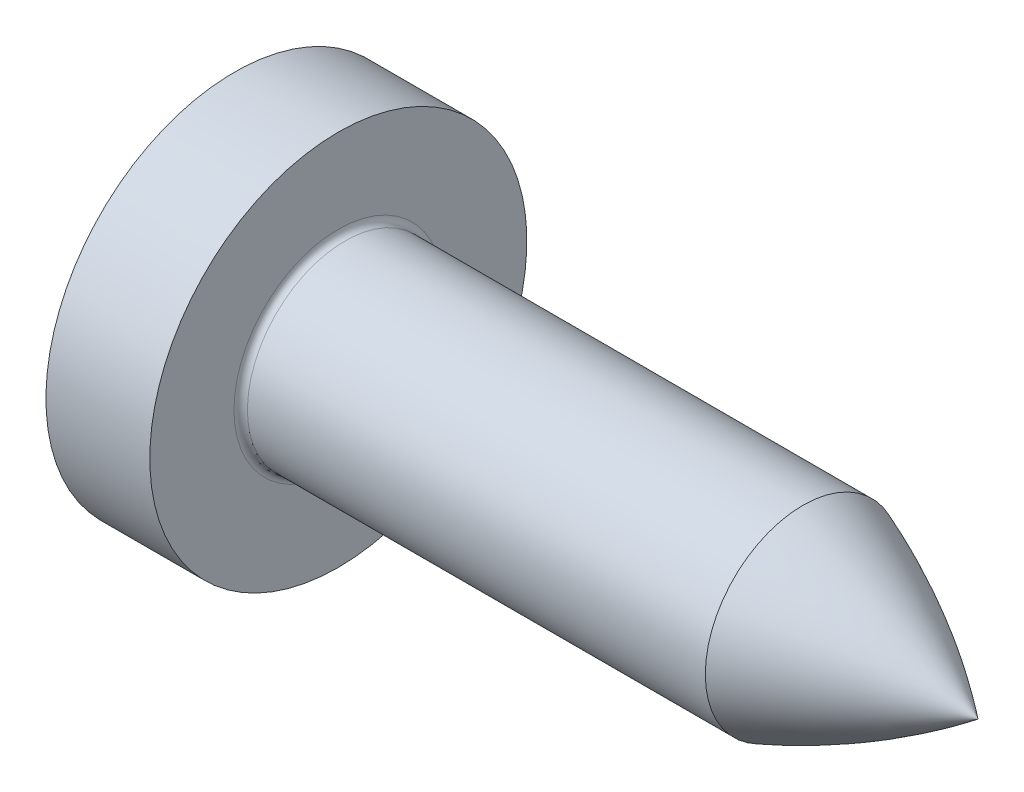
ISO-10303-21;
HEADER;
FILE_DESCRIPTION(('STEP AP214'),'2;1');
FILE_NAME('part.step','',(''),(''),'','','');
FILE_SCHEMA(('AUTOMOTIVE_DESIGN { 1 0 10303 214 1 1 1 1 }'));
ENDSEC;
DATA;
#1=APPLICATION_CONTEXT('core data for automotive mechanical design processes');
#2=APPLICATION_PROTOCOL_DEFINITION('international standard','automotive_design',2000,#1);
#3=PRODUCT_CONTEXT('',#1,'mechanical');
#4=PRODUCT('Part','Part','',(#3));
#5=PRODUCT_RELATED_PRODUCT_CATEGORY('part','',(#4));
#6=PRODUCT_DEFINITION_FORMATION('','',#4);
#7=PRODUCT_DEFINITION_CONTEXT('part definition',#1,'design');
#8=PRODUCT_DEFINITION('design','',#6,#7);
#9=PRODUCT_DEFINITION_SHAPE('','',#8);
#10=(LENGTH_UNIT() NAMED_UNIT(*) SI_UNIT(.MILLI.,.METRE.));
#11=(NAMED_UNIT(*) PLANE_ANGLE_UNIT() SI_UNIT($,.RADIAN.));
#12=(NAMED_UNIT(*) SI_UNIT($,.STERADIAN.) SOLID_ANGLE_UNIT());
#13=UNCERTAINTY_MEASURE_WITH_UNIT(LENGTH_MEASURE(1.E-05),#10,'distance_accuracy_value','');
#14=(GEOMETRIC_REPRESENTATION_CONTEXT(3) GLOBAL_UNCERTAINTY_ASSIGNED_CONTEXT((#13)) GLOBAL_UNIT_ASSIGNED_CONTEXT((#10,
#11,#12)) REPRESENTATION_CONTEXT('',''));
#15=CARTESIAN_POINT('',(0.,0.,0.));
#16=DIRECTION('',(0.,0.,1.));
#17=DIRECTION('',(1.,0.,0.));
#18=AXIS2_PLACEMENT_3D('',#15,#16,#17);
#19=CARTESIAN_POINT('',(-65.5475361696032,0.,0.));
#20=DIRECTION('',(-1.,0.,0.));
#21=DIRECTION('',(0.,-1.,0.));
#22=AXIS2_PLACEMENT_3D('',#19,#20,#21);
#23=CYLINDRICAL_SURFACE('',#22,1.45);
#24=CARTESIAN_POINT('',(2.5,0.,0.));
#25=DIRECTION('',(-1.,0.,0.));
#26=DIRECTION('',(0.,-1.,0.));
#27=AXIS2_PLACEMENT_3D('',#24,#25,#26);
#28=CIRCLE('',#27,1.45);
#29=CARTESIAN_POINT('',(2.5,-1.45000000000001,0.));
#30=VERTEX_POINT('',#29);
#31=EDGE_CURVE('E11',#30,#30,#28,.F.);
#32=ORIENTED_EDGE('',*,*,#31,.T.);
#33=EDGE_LOOP('',(#32));
#34=FACE_BOUND('',#33,.T.);
#35=CARTESIAN_POINT('',(9.3,0.,0.));
#36=DIRECTION('',(1.,0.,0.));
#37=DIRECTION('',(0.,1.,0.));
#38=AXIS2_PLACEMENT_3D('',#35,#36,#37);
#39=CIRCLE('',#38,1.45);
#40=CARTESIAN_POINT('',(9.3,1.45,0.));
#41=VERTEX_POINT('',#40);
#42=EDGE_CURVE('E254',#41,#41,#39,.T.);
#43=ORIENTED_EDGE('',*,*,#42,.F.);
#44=EDGE_LOOP('',(#43));
#45=FACE_BOUND('',#44,.T.);
#46=ADVANCED_FACE('F40',(#34,#45),#23,.T.);
#47=CARTESIAN_POINT('',(5.,0.,0.));
#48=DIRECTION('',(-1.,0.,0.));
#49=DIRECTION('',(0.,1.,0.));
#50=AXIS2_PLACEMENT_3D('',#47,#48,#49);
#51=SPHERICAL_SURFACE('',#50,5.);
#52=CARTESIAN_POINT('',(0.857536964558411,0.,0.));
#53=DIRECTION('',(-1.,0.,0.));
#54=DIRECTION('',(0.,-1.,0.));
#55=AXIS2_PLACEMENT_3D('',#52,#53,#54);
#56=CIRCLE('',#55,2.8);
#57=CARTESIAN_POINT('',(0.857536964558411,-2.80000000000001,0.));
#58=VERTEX_POINT('',#57);
#59=EDGE_CURVE('E212',#58,#58,#56,.T.);
#60=ORIENTED_EDGE('',*,*,#59,.T.);
#61=EDGE_LOOP('',(#60));
#62=FACE_BOUND('',#61,.T.);
#63=CARTESIAN_POINT('',(5.,0.,-0.300000000000001));
#64=DIRECTION('',(0.,0.,1.));
#65=DIRECTION('',(0.,-1.,0.));
#66=AXIS2_PLACEMENT_3D('',#63,#64,#65);
#67=CIRCLE('',#66,4.99099188538711);
#68=CARTESIAN_POINT('',(0.204192141108154,1.3821096123648,-0.300000000000001));
#69=VERTEX_POINT('',#68);
#70=CARTESIAN_POINT('',(0.01803251716754,0.299999999999999,-0.300000000000001));
#71=VERTEX_POINT('',#70);
#72=EDGE_CURVE('E171',#69,#71,#67,.T.);
#73=ORIENTED_EDGE('',*,*,#72,.F.);
#74=CARTESIAN_POINT('',(4.39951905283833,-1.0400635094611,0.));
#75=DIRECTION('',(-0.500000000000001,-0.866025403784438,0.));
#76=DIRECTION('',(0.866025403784438,-0.500000000000001,0.));
#77=AXIS2_PLACEMENT_3D('',#74,#75,#76);
#78=CIRCLE('',#77,4.8536265336739);
#79=CARTESIAN_POINT('',(0.204192141108154,1.3821096123648,0.299999999999999));
#80=VERTEX_POINT('',#79);
#81=EDGE_CURVE('E201',#80,#69,#78,.T.);
#82=ORIENTED_EDGE('',*,*,#81,.F.);
#83=CARTESIAN_POINT('',(5.,0.,0.299999999999999));
#84=DIRECTION('',(0.,0.,-1.));
#85=DIRECTION('',(0.,1.,0.));
#86=AXIS2_PLACEMENT_3D('',#83,#84,#85);
#87=CIRCLE('',#86,4.99099188538711);
#88=CARTESIAN_POINT('',(0.01803251716754,0.299999999999999,0.299999999999999));
#89=VERTEX_POINT('',#88);
#90=EDGE_CURVE('E175',#89,#80,#87,.T.);
#91=ORIENTED_EDGE('',*,*,#90,.F.);
#92=CARTESIAN_POINT('',(5.,0.299999999999999,0.));
#93=DIRECTION('',(0.,-1.,0.));
#94=DIRECTION('',(0.,0.,-1.));
#95=AXIS2_PLACEMENT_3D('',#92,#93,#94);
#96=CIRCLE('',#95,4.99099188538711);
#97=CARTESIAN_POINT('',(0.204192141108152,0.299999999999999,1.3821096123648));
#98=VERTEX_POINT('',#97);
#99=EDGE_CURVE('E167',#98,#89,#96,.T.);
#100=ORIENTED_EDGE('',*,*,#99,.F.);
#101=CARTESIAN_POINT('',(4.39951905283833,0.,-1.0400635094611));
#102=DIRECTION('',(-0.500000000000001,0.,-0.866025403784438));
#103=DIRECTION('',(-0.866025403784438,0.,0.500000000000001));
#104=AXIS2_PLACEMENT_3D('',#101,#102,#103);
#105=CIRCLE('',#104,4.8536265336739);
#106=CARTESIAN_POINT('',(0.204192141108151,-0.300000000000001,1.3821096123648));
#107=VERTEX_POINT('',#106);
#108=EDGE_CURVE('E165',#107,#98,#105,.T.);
#109=ORIENTED_EDGE('',*,*,#108,.F.);
#110=CARTESIAN_POINT('',(5.,-0.300000000000001,0.));
#111=DIRECTION('',(0.,1.,0.));
#112=DIRECTION('',(0.,0.,1.));
#113=AXIS2_PLACEMENT_3D('',#110,#111,#112);
#114=CIRCLE('',#113,4.99099188538711);
#115=CARTESIAN_POINT('',(0.0180325171675391,-0.300000000000001,0.299999999999999));
#116=VERTEX_POINT('',#115);
#117=EDGE_CURVE('E149',#116,#107,#114,.T.);
#118=ORIENTED_EDGE('',*,*,#117,.F.);
#119=CARTESIAN_POINT('',(5.,0.,0.299999999999999));
#120=DIRECTION('',(0.,0.,-1.));
#121=DIRECTION('',(0.,1.,0.));
#122=AXIS2_PLACEMENT_3D('',#119,#120,#121);
#123=CIRCLE('',#122,4.99099188538711);
#124=CARTESIAN_POINT('',(0.204192141108149,-1.38210961236481,0.299999999999999));
#125=VERTEX_POINT('',#124);
#126=EDGE_CURVE('E139',#125,#116,#123,.T.);
#127=ORIENTED_EDGE('',*,*,#126,.F.);
#128=CARTESIAN_POINT('',(4.39951905283832,1.0400635094611,0.));
#129=DIRECTION('',(-0.500000000000001,0.866025403784438,0.));
#130=DIRECTION('',(-0.866025403784438,-0.500000000000001,0.));
#131=AXIS2_PLACEMENT_3D('',#128,#129,#130);
#132=CIRCLE('',#131,4.85362653367389);
#133=CARTESIAN_POINT('',(0.204192141108149,-1.3821096123648,-0.300000000000001));
#134=VERTEX_POINT('',#133);
#135=EDGE_CURVE('E150',#134,#125,#132,.T.);
#136=ORIENTED_EDGE('',*,*,#135,.F.);
#137=CARTESIAN_POINT('',(5.,0.,-0.300000000000001));
#138=DIRECTION('',(0.,0.,1.));
#139=DIRECTION('',(0.,-1.,0.));
#140=AXIS2_PLACEMENT_3D('',#137,#138,#139);
#141=CIRCLE('',#140,4.99099188538711);
#142=CARTESIAN_POINT('',(0.0180325171675391,-0.300000000000001,-0.300000000000001));
#143=VERTEX_POINT('',#142);
#144=EDGE_CURVE('E177',#143,#134,#141,.T.);
#145=ORIENTED_EDGE('',*,*,#144,.F.);
#146=CARTESIAN_POINT('',(5.,-0.300000000000001,0.));
#147=DIRECTION('',(0.,1.,0.));
#148=DIRECTION('',(0.,0.,1.));
#149=AXIS2_PLACEMENT_3D('',#146,#147,#148);
#150=CIRCLE('',#149,4.99099188538711);
#151=CARTESIAN_POINT('',(0.204192141108151,-0.3,-1.3821096123648));
#152=VERTEX_POINT('',#151);
#153=EDGE_CURVE('E189',#152,#143,#150,.T.);
#154=ORIENTED_EDGE('',*,*,#153,.F.);
#155=CARTESIAN_POINT('',(4.39951905283833,0.,1.0400635094611));
#156=DIRECTION('',(-0.500000000000001,0.,0.866025403784438));
#157=DIRECTION('',(0.866025403784438,0.,0.500000000000001));
#158=AXIS2_PLACEMENT_3D('',#155,#156,#157);
#159=CIRCLE('',#158,4.8536265336739);
#160=CARTESIAN_POINT('',(0.204192141108152,0.299999999999999,-1.3821096123648));
#161=VERTEX_POINT('',#160);
#162=EDGE_CURVE('E187',#161,#152,#159,.T.);
#163=ORIENTED_EDGE('',*,*,#162,.F.);
#164=CARTESIAN_POINT('',(5.,0.299999999999999,0.));
#165=DIRECTION('',(0.,-1.,0.));
#166=DIRECTION('',(0.,0.,-1.));
#167=AXIS2_PLACEMENT_3D('',#164,#165,#166);
#168=CIRCLE('',#167,4.99099188538711);
#169=EDGE_CURVE('E190',#71,#161,#168,.T.);
#170=ORIENTED_EDGE('',*,*,#169,.F.);
#171=EDGE_LOOP('',(#73,#82,#91,#100,#109,#118,#127,#136,#145,#154,#163,#170));
#172=FACE_BOUND('',#171,.T.);
#173=ADVANCED_FACE('F162',(#62,#172),#51,.T.);
#174=CARTESIAN_POINT('',(2.4,1.44999999999998,0.));
#175=DIRECTION('',(-1.,0.,0.));
#176=DIRECTION('',(0.,-1.,0.));
#177=AXIS2_PLACEMENT_3D('',#174,#175,#176);
#178=PLANE('',#177);
#179=CARTESIAN_POINT('',(2.4,0.,0.));
#180=DIRECTION('',(-1.,0.,0.));
#181=DIRECTION('',(0.,-1.,0.));
#182=AXIS2_PLACEMENT_3D('',#179,#180,#181);
#183=CIRCLE('',#182,1.55);
#184=CARTESIAN_POINT('',(2.4,-1.55000000000001,0.));
#185=VERTEX_POINT('',#184);
#186=EDGE_CURVE('E50',#185,#185,#183,.T.);
#187=ORIENTED_EDGE('',*,*,#186,.T.);
#188=EDGE_LOOP('',(#187));
#189=FACE_BOUND('',#188,.T.);
#190=CARTESIAN_POINT('',(2.4,0.,0.));
#191=DIRECTION('',(-1.,0.,0.));
#192=DIRECTION('',(0.,-1.,0.));
#193=AXIS2_PLACEMENT_3D('',#190,#191,#192);
#194=CIRCLE('',#193,2.8);
#195=CARTESIAN_POINT('',(2.4,-2.80000000000001,0.));
#196=VERTEX_POINT('',#195);
#197=EDGE_CURVE('E232',#196,#196,#194,.T.);
#198=ORIENTED_EDGE('',*,*,#197,.F.);
#199=EDGE_LOOP('',(#198));
#200=FACE_BOUND('',#199,.T.);
#201=ADVANCED_FACE('F268',(#189,#200),#178,.F.);
#202=CARTESIAN_POINT('',(-65.5475361696032,0.,0.));
#203=DIRECTION('',(-1.,0.,0.));
#204=DIRECTION('',(0.,-1.,0.));
#205=AXIS2_PLACEMENT_3D('',#202,#203,#204);
#206=CYLINDRICAL_SURFACE('',#205,2.8);
#207=ORIENTED_EDGE('',*,*,#59,.F.);
#208=EDGE_LOOP('',(#207));
#209=FACE_BOUND('',#208,.T.);
#210=ORIENTED_EDGE('',*,*,#197,.T.);
#211=EDGE_LOOP('',(#210));
#212=FACE_BOUND('',#211,.T.);
#213=ADVANCED_FACE('F293',(#209,#212),#206,.T.);
#214=CARTESIAN_POINT('',(1.75,1.5,-0.300000000000001));
#215=DIRECTION('',(0.,0.,1.));
#216=DIRECTION('',(0.,-1.,0.));
#217=AXIS2_PLACEMENT_3D('',#214,#215,#216);
#218=PLANE('',#217);
#219=ORIENTED_EDGE('',*,*,#72,.T.);
#220=DIRECTION('',(-1.,0.,0.));
#221=VECTOR('',#220,1.);
#222=CARTESIAN_POINT('',(1.75,0.299999999999999,-0.300000000000001));
#223=LINE('',#222,#221);
#224=CARTESIAN_POINT('',(1.75,0.299999999999999,-0.300000000000001));
#225=VERTEX_POINT('',#224);
#226=EDGE_CURVE('E59',#225,#71,#223,.T.);
#227=ORIENTED_EDGE('',*,*,#226,.F.);
#228=DIRECTION('',(0.,1.,0.));
#229=VECTOR('',#228,1.);
#230=CARTESIAN_POINT('',(1.75,1.5,-0.300000000000001));
#231=LINE('',#230,#229);
#232=CARTESIAN_POINT('',(1.75,0.489637028918152,-0.300000000000001));
#233=VERTEX_POINT('',#232);
#234=EDGE_CURVE('E210',#225,#233,#231,.T.);
#235=ORIENTED_EDGE('',*,*,#234,.T.);
#236=DIRECTION('',(-0.866025403784438,0.500000000000001,0.));
#237=VECTOR('',#236,1.);
#238=CARTESIAN_POINT('',(0.,1.5,-0.300000000000001));
#239=LINE('',#238,#237);
#240=EDGE_CURVE('E206',#233,#69,#239,.T.);
#241=ORIENTED_EDGE('',*,*,#240,.T.);
#242=EDGE_LOOP('',(#219,#227,#235,#241));
#243=FACE_BOUND('',#242,.T.);
#244=ADVANCED_FACE('F249',(#243),#218,.T.);
#245=CARTESIAN_POINT('',(0.,1.5,0.));
#246=DIRECTION('',(-0.500000000000001,-0.866025403784438,0.));
#247=DIRECTION('',(0.866025403784438,-0.500000000000001,0.));
#248=AXIS2_PLACEMENT_3D('',#245,#246,#247);
#249=PLANE('',#248);
#250=ORIENTED_EDGE('',*,*,#81,.T.);
#251=ORIENTED_EDGE('',*,*,#240,.F.);
#252=DIRECTION('',(0.,0.,1.));
#253=VECTOR('',#252,1.);
#254=CARTESIAN_POINT('',(1.75,0.489637028918152,0.));
#255=LINE('',#254,#253);
#256=CARTESIAN_POINT('',(1.75,0.489637028918152,0.299999999999999));
#257=VERTEX_POINT('',#256);
#258=EDGE_CURVE('E208',#233,#257,#255,.T.);
#259=ORIENTED_EDGE('',*,*,#258,.T.);
#260=DIRECTION('',(-0.866025403784438,0.500000000000001,0.));
#261=VECTOR('',#260,1.);
#262=CARTESIAN_POINT('',(1.3125,0.742227771688615,0.299999999999999));
#263=LINE('',#262,#261);
#264=EDGE_CURVE('E203',#257,#80,#263,.T.);
#265=ORIENTED_EDGE('',*,*,#264,.T.);
#266=EDGE_LOOP('',(#250,#251,#259,#265));
#267=FACE_BOUND('',#266,.T.);
#268=ADVANCED_FACE('F244',(#267),#249,.T.);
#269=CARTESIAN_POINT('',(1.75,1.5,0.299999999999999));
#270=DIRECTION('',(0.,0.,-1.));
#271=DIRECTION('',(0.,1.,0.));
#272=AXIS2_PLACEMENT_3D('',#269,#270,#271);
#273=PLANE('',#272);
#274=ORIENTED_EDGE('',*,*,#90,.T.);
#275=ORIENTED_EDGE('',*,*,#264,.F.);
#276=DIRECTION('',(0.,-1.,0.));
#277=VECTOR('',#276,1.);
#278=CARTESIAN_POINT('',(1.75,1.5,0.299999999999999));
#279=LINE('',#278,#277);
#280=CARTESIAN_POINT('',(1.75,0.299999999999999,0.299999999999999));
#281=VERTEX_POINT('',#280);
#282=EDGE_CURVE('E125',#257,#281,#279,.T.);
#283=ORIENTED_EDGE('',*,*,#282,.T.);
#284=DIRECTION('',(-1.,0.,0.));
#285=VECTOR('',#284,1.);
#286=CARTESIAN_POINT('',(1.75,0.299999999999999,0.299999999999999));
#287=LINE('',#286,#285);
#288=EDGE_CURVE('E207',#281,#89,#287,.T.);
#289=ORIENTED_EDGE('',*,*,#288,.T.);
#290=EDGE_LOOP('',(#274,#275,#283,#289));
#291=FACE_BOUND('',#290,.T.);
#292=ADVANCED_FACE('F241',(#291),#273,.T.);
#293=CARTESIAN_POINT('',(1.75,0.299999999999999,0.299999999999999));
#294=DIRECTION('',(0.,-1.,0.));
#295=DIRECTION('',(0.,0.,-1.));
#296=AXIS2_PLACEMENT_3D('',#293,#294,#295);
#297=PLANE('',#296);
#298=ORIENTED_EDGE('',*,*,#99,.T.);
#299=ORIENTED_EDGE('',*,*,#288,.F.);
#300=DIRECTION('',(0.,0.,1.));
#301=VECTOR('',#300,1.);
#302=CARTESIAN_POINT('',(1.75,0.299999999999999,0.299999999999999));
#303=LINE('',#302,#301);
#304=CARTESIAN_POINT('',(1.75,0.299999999999999,0.489637028918151));
#305=VERTEX_POINT('',#304);
#306=EDGE_CURVE('E117',#281,#305,#303,.T.);
#307=ORIENTED_EDGE('',*,*,#306,.T.);
#308=DIRECTION('',(-0.866025403784438,0.,0.500000000000001));
#309=VECTOR('',#308,1.);
#310=CARTESIAN_POINT('',(0.,0.299999999999999,1.5));
#311=LINE('',#310,#309);
#312=EDGE_CURVE('E44',#305,#98,#311,.T.);
#313=ORIENTED_EDGE('',*,*,#312,.T.);
#314=EDGE_LOOP('',(#298,#299,#307,#313));
#315=FACE_BOUND('',#314,.T.);
#316=ADVANCED_FACE('F286',(#315),#297,.T.);
#317=CARTESIAN_POINT('',(0.,0.,1.5));
#318=DIRECTION('',(-0.500000000000001,0.,-0.866025403784438));
#319=DIRECTION('',(-0.866025403784438,0.,0.500000000000001));
#320=AXIS2_PLACEMENT_3D('',#317,#318,#319);
#321=PLANE('',#320);
#322=ORIENTED_EDGE('',*,*,#108,.T.);
#323=ORIENTED_EDGE('',*,*,#312,.F.);
#324=DIRECTION('',(0.,-1.,0.));
#325=VECTOR('',#324,1.);
#326=CARTESIAN_POINT('',(1.75,0.,0.489637028918151));
#327=LINE('',#326,#325);
#328=CARTESIAN_POINT('',(1.75,-0.300000000000001,0.489637028918151));
#329=VERTEX_POINT('',#328);
#330=EDGE_CURVE('E214',#305,#329,#327,.T.);
#331=ORIENTED_EDGE('',*,*,#330,.T.);
#332=DIRECTION('',(-0.866025403784438,0.,0.500000000000001));
#333=VECTOR('',#332,1.);
#334=CARTESIAN_POINT('',(1.83211524227066,-0.300000000000001,0.442227771688613));
#335=LINE('',#334,#333);
#336=EDGE_CURVE('E158',#329,#107,#335,.T.);
#337=ORIENTED_EDGE('',*,*,#336,.T.);
#338=EDGE_LOOP('',(#322,#323,#331,#337));
#339=FACE_BOUND('',#338,.T.);
#340=ADVANCED_FACE('F284',(#339),#321,.T.);
#341=CARTESIAN_POINT('',(1.75,-0.300000000000001,0.299999999999999));
#342=DIRECTION('',(0.,1.,0.));
#343=DIRECTION('',(0.,0.,1.));
#344=AXIS2_PLACEMENT_3D('',#341,#342,#343);
#345=PLANE('',#344);
#346=ORIENTED_EDGE('',*,*,#117,.T.);
#347=ORIENTED_EDGE('',*,*,#336,.F.);
#348=DIRECTION('',(0.,0.,-1.));
#349=VECTOR('',#348,1.);
#350=CARTESIAN_POINT('',(1.75,-0.300000000000001,0.299999999999999));
#351=LINE('',#350,#349);
#352=CARTESIAN_POINT('',(1.75,-0.300000000000001,0.299999999999999));
#353=VERTEX_POINT('',#352);
#354=EDGE_CURVE('E157',#329,#353,#351,.T.);
#355=ORIENTED_EDGE('',*,*,#354,.T.);
#356=DIRECTION('',(-1.,0.,0.));
#357=VECTOR('',#356,1.);
#358=CARTESIAN_POINT('',(1.75,-0.300000000000001,0.299999999999999));
#359=LINE('',#358,#357);
#360=EDGE_CURVE('E142',#353,#116,#359,.T.);
#361=ORIENTED_EDGE('',*,*,#360,.T.);
#362=EDGE_LOOP('',(#346,#347,#355,#361));
#363=FACE_BOUND('',#362,.T.);
#364=ADVANCED_FACE('F153',(#363),#345,.T.);
#365=CARTESIAN_POINT('',(1.75,-1.5,0.299999999999999));
#366=DIRECTION('',(0.,0.,-1.));
#367=DIRECTION('',(0.,1.,0.));
#368=AXIS2_PLACEMENT_3D('',#365,#366,#367);
#369=PLANE('',#368);
#370=ORIENTED_EDGE('',*,*,#126,.T.);
#371=ORIENTED_EDGE('',*,*,#360,.F.);
#372=DIRECTION('',(0.,-1.,0.));
#373=VECTOR('',#372,1.);
#374=CARTESIAN_POINT('',(1.75,-1.5,0.299999999999999));
#375=LINE('',#374,#373);
#376=CARTESIAN_POINT('',(1.75,-0.489637028918154,0.299999999999999));
#377=VERTEX_POINT('',#376);
#378=EDGE_CURVE('E185',#353,#377,#375,.T.);
#379=ORIENTED_EDGE('',*,*,#378,.T.);
#380=DIRECTION('',(-0.866025403784438,-0.500000000000001,0.));
#381=VECTOR('',#380,1.);
#382=CARTESIAN_POINT('',(0.,-1.5,0.299999999999999));
#383=LINE('',#382,#381);
#384=EDGE_CURVE('E145',#377,#125,#383,.T.);
#385=ORIENTED_EDGE('',*,*,#384,.T.);
#386=EDGE_LOOP('',(#370,#371,#379,#385));
#387=FACE_BOUND('',#386,.T.);
#388=ADVANCED_FACE('F141',(#387),#369,.T.);
#389=CARTESIAN_POINT('',(0.,-1.5,0.));
#390=DIRECTION('',(-0.500000000000001,0.866025403784438,0.));
#391=DIRECTION('',(-0.866025403784438,-0.500000000000001,0.));
#392=AXIS2_PLACEMENT_3D('',#389,#390,#391);
#393=PLANE('',#392);
#394=ORIENTED_EDGE('',*,*,#135,.T.);
#395=ORIENTED_EDGE('',*,*,#384,.F.);
#396=DIRECTION('',(0.,0.,-1.));
#397=VECTOR('',#396,1.);
#398=CARTESIAN_POINT('',(1.75,-0.489637028918154,0.));
#399=LINE('',#398,#397);
#400=CARTESIAN_POINT('',(1.75,-0.489637028918154,-0.300000000000001));
#401=VERTEX_POINT('',#400);
#402=EDGE_CURVE('E182',#377,#401,#399,.T.);
#403=ORIENTED_EDGE('',*,*,#402,.T.);
#404=DIRECTION('',(-0.866025403784438,-0.500000000000001,0.));
#405=VECTOR('',#404,1.);
#406=CARTESIAN_POINT('',(1.3125,-0.742227771688617,-0.300000000000001));
#407=LINE('',#406,#405);
#408=EDGE_CURVE('E178',#401,#134,#407,.T.);
#409=ORIENTED_EDGE('',*,*,#408,.T.);
#410=EDGE_LOOP('',(#394,#395,#403,#409));
#411=FACE_BOUND('',#410,.T.);
#412=ADVANCED_FACE('F279',(#411),#393,.T.);
#413=CARTESIAN_POINT('',(1.75,-1.5,-0.300000000000001));
#414=DIRECTION('',(0.,0.,1.));
#415=DIRECTION('',(0.,-1.,0.));
#416=AXIS2_PLACEMENT_3D('',#413,#414,#415);
#417=PLANE('',#416);
#418=ORIENTED_EDGE('',*,*,#144,.T.);
#419=ORIENTED_EDGE('',*,*,#408,.F.);
#420=DIRECTION('',(0.,1.,0.));
#421=VECTOR('',#420,1.);
#422=CARTESIAN_POINT('',(1.75,-1.5,-0.300000000000001));
#423=LINE('',#422,#421);
#424=CARTESIAN_POINT('',(1.75,-0.300000000000001,-0.300000000000001));
#425=VERTEX_POINT('',#424);
#426=EDGE_CURVE('E184',#401,#425,#423,.T.);
#427=ORIENTED_EDGE('',*,*,#426,.T.);
#428=DIRECTION('',(-1.,0.,0.));
#429=VECTOR('',#428,1.);
#430=CARTESIAN_POINT('',(1.75,-0.300000000000001,-0.300000000000001));
#431=LINE('',#430,#429);
#432=EDGE_CURVE('E181',#425,#143,#431,.T.);
#433=ORIENTED_EDGE('',*,*,#432,.T.);
#434=EDGE_LOOP('',(#418,#419,#427,#433));
#435=FACE_BOUND('',#434,.T.);
#436=ADVANCED_FACE('F282',(#435),#417,.T.);
#437=CARTESIAN_POINT('',(1.75,-0.300000000000001,-0.300000000000001));
#438=DIRECTION('',(0.,1.,0.));
#439=DIRECTION('',(0.,0.,1.));
#440=AXIS2_PLACEMENT_3D('',#437,#438,#439);
#441=PLANE('',#440);
#442=ORIENTED_EDGE('',*,*,#153,.T.);
#443=ORIENTED_EDGE('',*,*,#432,.F.);
#444=DIRECTION('',(0.,0.,-1.));
#445=VECTOR('',#444,1.);
#446=CARTESIAN_POINT('',(1.75,-0.300000000000001,-0.300000000000001));
#447=LINE('',#446,#445);
#448=CARTESIAN_POINT('',(1.75,-0.300000000000001,-0.489637028918153));
#449=VERTEX_POINT('',#448);
#450=EDGE_CURVE('E198',#425,#449,#447,.T.);
#451=ORIENTED_EDGE('',*,*,#450,.T.);
#452=DIRECTION('',(-0.866025403784438,0.,-0.500000000000001));
#453=VECTOR('',#452,1.);
#454=CARTESIAN_POINT('',(0.,-0.3,-1.5));
#455=LINE('',#454,#453);
#456=EDGE_CURVE('E194',#449,#152,#455,.T.);
#457=ORIENTED_EDGE('',*,*,#456,.T.);
#458=EDGE_LOOP('',(#442,#443,#451,#457));
#459=FACE_BOUND('',#458,.T.);
#460=ADVANCED_FACE('F308',(#459),#441,.T.);
#461=CARTESIAN_POINT('',(0.,0.,-1.5));
#462=DIRECTION('',(-0.500000000000001,0.,0.866025403784438));
#463=DIRECTION('',(0.866025403784438,0.,0.500000000000001));
#464=AXIS2_PLACEMENT_3D('',#461,#462,#463);
#465=PLANE('',#464);
#466=ORIENTED_EDGE('',*,*,#162,.T.);
#467=ORIENTED_EDGE('',*,*,#456,.F.);
#468=DIRECTION('',(0.,1.,0.));
#469=VECTOR('',#468,1.);
#470=CARTESIAN_POINT('',(1.75,0.,-0.489637028918153));
#471=LINE('',#470,#469);
#472=CARTESIAN_POINT('',(1.75,0.299999999999999,-0.489637028918153));
#473=VERTEX_POINT('',#472);
#474=EDGE_CURVE('E195',#449,#473,#471,.T.);
#475=ORIENTED_EDGE('',*,*,#474,.T.);
#476=DIRECTION('',(-0.866025403784438,0.,-0.500000000000001));
#477=VECTOR('',#476,1.);
#478=CARTESIAN_POINT('',(1.83211524227066,0.299999999999999,-0.442227771688614));
#479=LINE('',#478,#477);
#480=EDGE_CURVE('E191',#473,#161,#479,.T.);
#481=ORIENTED_EDGE('',*,*,#480,.T.);
#482=EDGE_LOOP('',(#466,#467,#475,#481));
#483=FACE_BOUND('',#482,.T.);
#484=ADVANCED_FACE('F42',(#483),#465,.T.);
#485=CARTESIAN_POINT('',(1.75,0.299999999999999,-0.300000000000001));
#486=DIRECTION('',(0.,-1.,0.));
#487=DIRECTION('',(0.,0.,-1.));
#488=AXIS2_PLACEMENT_3D('',#485,#486,#487);
#489=PLANE('',#488);
#490=ORIENTED_EDGE('',*,*,#169,.T.);
#491=ORIENTED_EDGE('',*,*,#480,.F.);
#492=DIRECTION('',(0.,0.,1.));
#493=VECTOR('',#492,1.);
#494=CARTESIAN_POINT('',(1.75,0.299999999999999,-0.300000000000001));
#495=LINE('',#494,#493);
#496=EDGE_CURVE('E197',#473,#225,#495,.T.);
#497=ORIENTED_EDGE('',*,*,#496,.T.);
#498=ORIENTED_EDGE('',*,*,#226,.T.);
#499=EDGE_LOOP('',(#490,#491,#497,#498));
#500=FACE_BOUND('',#499,.T.);
#501=ADVANCED_FACE('F313',(#500),#489,.T.);
#502=CARTESIAN_POINT('',(1.75,-0.300000000000001,-0.300000000000001));
#503=DIRECTION('',(1.,0.,0.));
#504=DIRECTION('',(0.,0.,-1.));
#505=AXIS2_PLACEMENT_3D('',#502,#503,#504);
#506=PLANE('',#505);
#507=ORIENTED_EDGE('',*,*,#234,.F.);
#508=ORIENTED_EDGE('',*,*,#496,.F.);
#509=ORIENTED_EDGE('',*,*,#474,.F.);
#510=ORIENTED_EDGE('',*,*,#450,.F.);
#511=ORIENTED_EDGE('',*,*,#426,.F.);
#512=ORIENTED_EDGE('',*,*,#402,.F.);
#513=ORIENTED_EDGE('',*,*,#378,.F.);
#514=ORIENTED_EDGE('',*,*,#354,.F.);
#515=ORIENTED_EDGE('',*,*,#330,.F.);
#516=ORIENTED_EDGE('',*,*,#306,.F.);
#517=ORIENTED_EDGE('',*,*,#282,.F.);
#518=ORIENTED_EDGE('',*,*,#258,.F.);
#519=EDGE_LOOP('',(#507,#508,#509,#510,#511,#512,#513,#514,#515,#516,#517,#518));
#520=FACE_BOUND('',#519,.T.);
#521=ADVANCED_FACE('F277',(#520),#506,.F.);
#522=CARTESIAN_POINT('',(2.5,0.,0.));
#523=DIRECTION('',(-1.,0.,0.));
#524=DIRECTION('',(0.,-1.,0.));
#525=AXIS2_PLACEMENT_3D('',#522,#523,#524);
#526=TOROIDAL_SURFACE('',#525,1.55,0.1);
#527=ORIENTED_EDGE('',*,*,#31,.F.);
#528=EDGE_LOOP('',(#527));
#529=FACE_BOUND('',#528,.T.);
#530=ORIENTED_EDGE('',*,*,#186,.F.);
#531=EDGE_LOOP('',(#530));
#532=FACE_BOUND('',#531,.T.);
#533=ADVANCED_FACE('F274',(#529,#532),#526,.F.);
#534=CARTESIAN_POINT('',(5.58664071376654,-8.26447182359101,0.));
#535=DIRECTION('',(0.,0.,-1.));
#536=DIRECTION('',(0.,1.,0.));
#537=AXIS2_PLACEMENT_3D('',#534,#535,#536);
#538=CIRCLE('',#537,10.4);
#539=TRIMMED_CURVE('',#538,(PARAMETER_VALUE(-0.652347794845729)),
(PARAMETER_VALUE(0.652347794845729)),.T.,.PARAMETER.);
#540=CARTESIAN_POINT('',(5.58664071376654,0.,0.));
#541=DIRECTION('',(1.,0.,0.));
#542=AXIS1_PLACEMENT('',#540,#541);
#543=SURFACE_OF_REVOLUTION('',#539,#542);
#544=ORIENTED_EDGE('',*,*,#42,.T.);
#545=EDGE_LOOP('',(#544));
#546=FACE_BOUND('',#545,.T.);
#547=CARTESIAN_POINT('',(11.9,0.,0.));
#548=VERTEX_POINT('',#547);
#549=VERTEX_LOOP('',#548);
#550=FACE_BOUND('',#549,.T.);
#551=ADVANCED_FACE('F259',(#546,#550),#543,.T.);
#552=CLOSED_SHELL('',(#46,#173,#201,#213,#244,#268,#292,#316,#340,#364,#388,#412,#436,#460,#484,
#501,#521,#533,#551));
#553=MANIFOLD_SOLID_BREP('B2',#552);
#554=ADVANCED_BREP_SHAPE_REPRESENTATION('',(#18,#553),#14);
#555=SHAPE_DEFINITION_REPRESENTATION(#9,#554);
ENDSEC;
END-ISO-10303-21;
